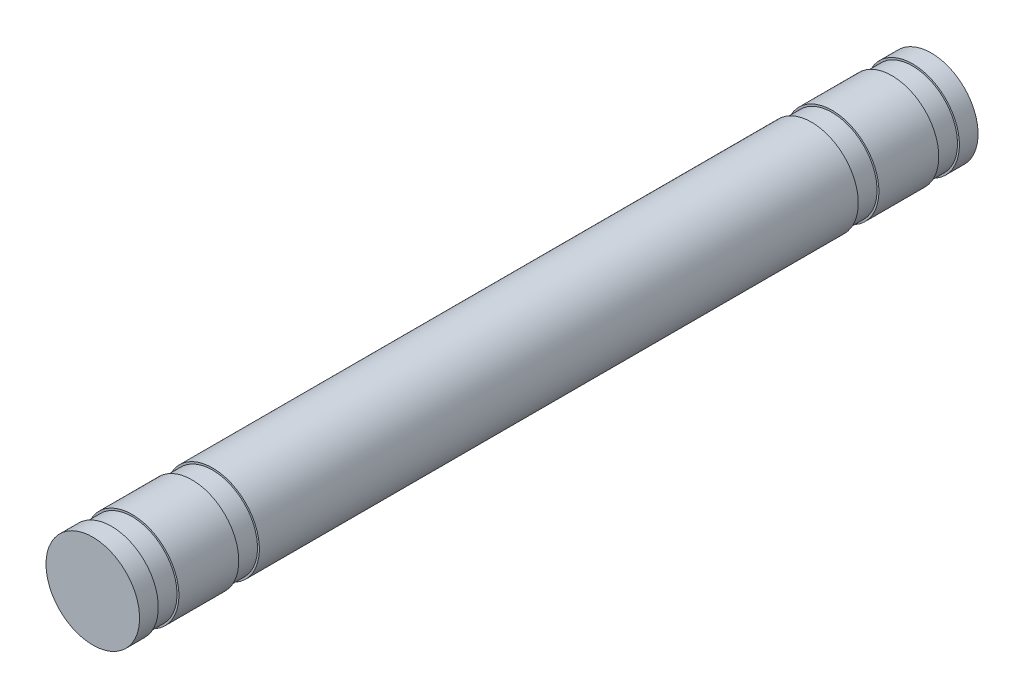
ISO-10303-21;
HEADER;
FILE_DESCRIPTION(('STEP AP214'),'2;1');
FILE_NAME('part.step','',(''),(''),'','','');
FILE_SCHEMA(('AUTOMOTIVE_DESIGN { 1 0 10303 214 1 1 1 1 }'));
ENDSEC;
DATA;
#1=APPLICATION_CONTEXT('core data for automotive mechanical design processes');
#2=APPLICATION_PROTOCOL_DEFINITION('international standard','automotive_design',2000,#1);
#3=PRODUCT_CONTEXT('',#1,'mechanical');
#4=PRODUCT('Part','Part','',(#3));
#5=PRODUCT_RELATED_PRODUCT_CATEGORY('part','',(#4));
#6=PRODUCT_DEFINITION_FORMATION('','',#4);
#7=PRODUCT_DEFINITION_CONTEXT('part definition',#1,'design');
#8=PRODUCT_DEFINITION('design','',#6,#7);
#9=PRODUCT_DEFINITION_SHAPE('','',#8);
#10=(LENGTH_UNIT() NAMED_UNIT(*) SI_UNIT(.MILLI.,.METRE.));
#11=(NAMED_UNIT(*) PLANE_ANGLE_UNIT() SI_UNIT($,.RADIAN.));
#12=(NAMED_UNIT(*) SI_UNIT($,.STERADIAN.) SOLID_ANGLE_UNIT());
#13=UNCERTAINTY_MEASURE_WITH_UNIT(LENGTH_MEASURE(1.E-05),#10,'distance_accuracy_value','');
#14=(GEOMETRIC_REPRESENTATION_CONTEXT(3) GLOBAL_UNCERTAINTY_ASSIGNED_CONTEXT((#13)) GLOBAL_UNIT_ASSIGNED_CONTEXT((#10,
#11,#12)) REPRESENTATION_CONTEXT('',''));
#15=CARTESIAN_POINT('',(0.,0.,0.));
#16=DIRECTION('',(0.,0.,1.));
#17=DIRECTION('',(1.,0.,0.));
#18=AXIS2_PLACEMENT_3D('',#15,#16,#17);
#19=CARTESIAN_POINT('',(0.,0.,0.));
#20=DIRECTION('',(0.,0.,1.));
#21=DIRECTION('',(1.,0.,0.));
#22=AXIS2_PLACEMENT_3D('',#19,#20,#21);
#23=PLANE('',#22);
#24=CARTESIAN_POINT('',(0.,0.,0.));
#25=DIRECTION('',(0.,0.,-1.));
#26=DIRECTION('',(-1.,0.,0.));
#27=AXIS2_PLACEMENT_3D('',#24,#25,#26);
#28=CIRCLE('',#27,2.5);
#29=CARTESIAN_POINT('',(-2.5,0.,0.));
#30=VERTEX_POINT('',#29);
#31=EDGE_CURVE('E12',#30,#30,#28,.T.);
#32=ORIENTED_EDGE('',*,*,#31,.F.);
#33=EDGE_LOOP('',(#32));
#34=FACE_BOUND('',#33,.T.);
#35=ADVANCED_FACE('F47',(#34),#23,.T.);
#36=CARTESIAN_POINT('',(0.,0.,-44.8));
#37=DIRECTION('',(0.,0.,-1.));
#38=DIRECTION('',(-1.,0.,0.));
#39=AXIS2_PLACEMENT_3D('',#36,#37,#38);
#40=CYLINDRICAL_SURFACE('',#39,2.5);
#41=ORIENTED_EDGE('',*,*,#31,.T.);
#42=EDGE_LOOP('',(#41));
#43=FACE_BOUND('',#42,.T.);
#44=CARTESIAN_POINT('',(0.,0.,-1.));
#45=DIRECTION('',(0.,0.,-1.));
#46=DIRECTION('',(-1.,0.,0.));
#47=AXIS2_PLACEMENT_3D('',#44,#45,#46);
#48=CIRCLE('',#47,2.5);
#49=CARTESIAN_POINT('',(-2.5,0.,-1.));
#50=VERTEX_POINT('',#49);
#51=EDGE_CURVE('E53',#50,#50,#48,.T.);
#52=ORIENTED_EDGE('',*,*,#51,.F.);
#53=EDGE_LOOP('',(#52));
#54=FACE_BOUND('',#53,.T.);
#55=ADVANCED_FACE('F125',(#43,#54),#40,.T.);
#56=CARTESIAN_POINT('',(-2.5,0.,-1.));
#57=DIRECTION('',(0.,0.,-1.));
#58=DIRECTION('',(-1.,0.,0.));
#59=AXIS2_PLACEMENT_3D('',#56,#57,#58);
#60=PLANE('',#59);
#61=ORIENTED_EDGE('',*,*,#51,.T.);
#62=EDGE_LOOP('',(#61));
#63=FACE_BOUND('',#62,.T.);
#64=CARTESIAN_POINT('',(0.,0.,-1.));
#65=DIRECTION('',(0.,0.,-1.));
#66=DIRECTION('',(-1.,0.,0.));
#67=AXIS2_PLACEMENT_3D('',#64,#65,#66);
#68=CIRCLE('',#67,2.4);
#69=CARTESIAN_POINT('',(-2.4,0.,-1.));
#70=VERTEX_POINT('',#69);
#71=EDGE_CURVE('E57',#70,#70,#68,.T.);
#72=ORIENTED_EDGE('',*,*,#71,.F.);
#73=EDGE_LOOP('',(#72));
#74=FACE_BOUND('',#73,.T.);
#75=ADVANCED_FACE('F130',(#63,#74),#60,.T.);
#76=CARTESIAN_POINT('',(0.,0.,-44.8));
#77=DIRECTION('',(0.,0.,-1.));
#78=DIRECTION('',(-1.,0.,0.));
#79=AXIS2_PLACEMENT_3D('',#76,#77,#78);
#80=CYLINDRICAL_SURFACE('',#79,2.4);
#81=ORIENTED_EDGE('',*,*,#71,.T.);
#82=EDGE_LOOP('',(#81));
#83=FACE_BOUND('',#82,.T.);
#84=CARTESIAN_POINT('',(0.,0.,-2.1));
#85=DIRECTION('',(0.,0.,-1.));
#86=DIRECTION('',(-1.,0.,0.));
#87=AXIS2_PLACEMENT_3D('',#84,#85,#86);
#88=CIRCLE('',#87,2.4);
#89=CARTESIAN_POINT('',(-2.4,0.,-2.1));
#90=VERTEX_POINT('',#89);
#91=EDGE_CURVE('E61',#90,#90,#88,.T.);
#92=ORIENTED_EDGE('',*,*,#91,.F.);
#93=EDGE_LOOP('',(#92));
#94=FACE_BOUND('',#93,.T.);
#95=ADVANCED_FACE('F134',(#83,#94),#80,.T.);
#96=CARTESIAN_POINT('',(-2.4,0.,-2.1));
#97=DIRECTION('',(0.,0.,1.));
#98=DIRECTION('',(1.,0.,0.));
#99=AXIS2_PLACEMENT_3D('',#96,#97,#98);
#100=PLANE('',#99);
#101=ORIENTED_EDGE('',*,*,#91,.T.);
#102=EDGE_LOOP('',(#101));
#103=FACE_BOUND('',#102,.T.);
#104=CARTESIAN_POINT('',(0.,0.,-2.1));
#105=DIRECTION('',(0.,0.,-1.));
#106=DIRECTION('',(-1.,0.,0.));
#107=AXIS2_PLACEMENT_3D('',#104,#105,#106);
#108=CIRCLE('',#107,2.5);
#109=CARTESIAN_POINT('',(-2.5,0.,-2.1));
#110=VERTEX_POINT('',#109);
#111=EDGE_CURVE('E66',#110,#110,#108,.T.);
#112=ORIENTED_EDGE('',*,*,#111,.F.);
#113=EDGE_LOOP('',(#112));
#114=FACE_BOUND('',#113,.T.);
#115=ADVANCED_FACE('F140',(#103,#114),#100,.T.);
#116=CARTESIAN_POINT('',(0.,0.,-44.8));
#117=DIRECTION('',(0.,0.,-1.));
#118=DIRECTION('',(-1.,0.,0.));
#119=AXIS2_PLACEMENT_3D('',#116,#117,#118);
#120=CYLINDRICAL_SURFACE('',#119,2.5);
#121=ORIENTED_EDGE('',*,*,#111,.T.);
#122=EDGE_LOOP('',(#121));
#123=FACE_BOUND('',#122,.T.);
#124=CARTESIAN_POINT('',(0.,0.,-5.3));
#125=DIRECTION('',(0.,0.,-1.));
#126=DIRECTION('',(-1.,0.,0.));
#127=AXIS2_PLACEMENT_3D('',#124,#125,#126);
#128=CIRCLE('',#127,2.5);
#129=CARTESIAN_POINT('',(-2.5,0.,-5.3));
#130=VERTEX_POINT('',#129);
#131=EDGE_CURVE('E69',#130,#130,#128,.T.);
#132=ORIENTED_EDGE('',*,*,#131,.F.);
#133=EDGE_LOOP('',(#132));
#134=FACE_BOUND('',#133,.T.);
#135=ADVANCED_FACE('F144',(#123,#134),#120,.T.);
#136=CARTESIAN_POINT('',(-2.5,0.,-5.3));
#137=DIRECTION('',(0.,0.,-1.));
#138=DIRECTION('',(-1.,0.,0.));
#139=AXIS2_PLACEMENT_3D('',#136,#137,#138);
#140=PLANE('',#139);
#141=ORIENTED_EDGE('',*,*,#131,.T.);
#142=EDGE_LOOP('',(#141));
#143=FACE_BOUND('',#142,.T.);
#144=CARTESIAN_POINT('',(0.,0.,-5.3));
#145=DIRECTION('',(0.,0.,-1.));
#146=DIRECTION('',(-1.,0.,0.));
#147=AXIS2_PLACEMENT_3D('',#144,#145,#146);
#148=CIRCLE('',#147,2.4);
#149=CARTESIAN_POINT('',(-2.4,0.,-5.3));
#150=VERTEX_POINT('',#149);
#151=EDGE_CURVE('E72',#150,#150,#148,.T.);
#152=ORIENTED_EDGE('',*,*,#151,.F.);
#153=EDGE_LOOP('',(#152));
#154=FACE_BOUND('',#153,.T.);
#155=ADVANCED_FACE('F148',(#143,#154),#140,.T.);
#156=CARTESIAN_POINT('',(0.,0.,-44.8));
#157=DIRECTION('',(0.,0.,-1.));
#158=DIRECTION('',(-1.,0.,0.));
#159=AXIS2_PLACEMENT_3D('',#156,#157,#158);
#160=CYLINDRICAL_SURFACE('',#159,2.4);
#161=ORIENTED_EDGE('',*,*,#151,.T.);
#162=EDGE_LOOP('',(#161));
#163=FACE_BOUND('',#162,.T.);
#164=CARTESIAN_POINT('',(0.,0.,-6.4));
#165=DIRECTION('',(0.,0.,-1.));
#166=DIRECTION('',(-1.,0.,0.));
#167=AXIS2_PLACEMENT_3D('',#164,#165,#166);
#168=CIRCLE('',#167,2.4);
#169=CARTESIAN_POINT('',(-2.4,0.,-6.4));
#170=VERTEX_POINT('',#169);
#171=EDGE_CURVE('E75',#170,#170,#168,.T.);
#172=ORIENTED_EDGE('',*,*,#171,.F.);
#173=EDGE_LOOP('',(#172));
#174=FACE_BOUND('',#173,.T.);
#175=ADVANCED_FACE('F152',(#163,#174),#160,.T.);
#176=CARTESIAN_POINT('',(-2.4,0.,-6.4));
#177=DIRECTION('',(0.,0.,1.));
#178=DIRECTION('',(1.,0.,0.));
#179=AXIS2_PLACEMENT_3D('',#176,#177,#178);
#180=PLANE('',#179);
#181=ORIENTED_EDGE('',*,*,#171,.T.);
#182=EDGE_LOOP('',(#181));
#183=FACE_BOUND('',#182,.T.);
#184=CARTESIAN_POINT('',(0.,0.,-6.4));
#185=DIRECTION('',(0.,0.,-1.));
#186=DIRECTION('',(-1.,0.,0.));
#187=AXIS2_PLACEMENT_3D('',#184,#185,#186);
#188=CIRCLE('',#187,2.5);
#189=CARTESIAN_POINT('',(-2.5,0.,-6.4));
#190=VERTEX_POINT('',#189);
#191=EDGE_CURVE('E78',#190,#190,#188,.T.);
#192=ORIENTED_EDGE('',*,*,#191,.F.);
#193=EDGE_LOOP('',(#192));
#194=FACE_BOUND('',#193,.T.);
#195=ADVANCED_FACE('F156',(#183,#194),#180,.T.);
#196=CARTESIAN_POINT('',(0.,0.,-44.8));
#197=DIRECTION('',(0.,0.,-1.));
#198=DIRECTION('',(-1.,0.,0.));
#199=AXIS2_PLACEMENT_3D('',#196,#197,#198);
#200=CYLINDRICAL_SURFACE('',#199,2.5);
#201=ORIENTED_EDGE('',*,*,#191,.T.);
#202=EDGE_LOOP('',(#201));
#203=FACE_BOUND('',#202,.T.);
#204=CARTESIAN_POINT('',(0.,0.,-38.4));
#205=DIRECTION('',(0.,0.,-1.));
#206=DIRECTION('',(-1.,0.,0.));
#207=AXIS2_PLACEMENT_3D('',#204,#205,#206);
#208=CIRCLE('',#207,2.5);
#209=CARTESIAN_POINT('',(-2.5,0.,-38.4));
#210=VERTEX_POINT('',#209);
#211=EDGE_CURVE('E81',#210,#210,#208,.T.);
#212=ORIENTED_EDGE('',*,*,#211,.F.);
#213=EDGE_LOOP('',(#212));
#214=FACE_BOUND('',#213,.T.);
#215=ADVANCED_FACE('F160',(#203,#214),#200,.T.);
#216=CARTESIAN_POINT('',(-2.5,0.,-38.4));
#217=DIRECTION('',(0.,0.,-1.));
#218=DIRECTION('',(-1.,0.,0.));
#219=AXIS2_PLACEMENT_3D('',#216,#217,#218);
#220=PLANE('',#219);
#221=ORIENTED_EDGE('',*,*,#211,.T.);
#222=EDGE_LOOP('',(#221));
#223=FACE_BOUND('',#222,.T.);
#224=CARTESIAN_POINT('',(0.,0.,-38.4));
#225=DIRECTION('',(0.,0.,-1.));
#226=DIRECTION('',(-1.,0.,0.));
#227=AXIS2_PLACEMENT_3D('',#224,#225,#226);
#228=CIRCLE('',#227,2.4);
#229=CARTESIAN_POINT('',(-2.4,0.,-38.4));
#230=VERTEX_POINT('',#229);
#231=EDGE_CURVE('E84',#230,#230,#228,.T.);
#232=ORIENTED_EDGE('',*,*,#231,.F.);
#233=EDGE_LOOP('',(#232));
#234=FACE_BOUND('',#233,.T.);
#235=ADVANCED_FACE('F164',(#223,#234),#220,.T.);
#236=CARTESIAN_POINT('',(0.,0.,-44.8));
#237=DIRECTION('',(0.,0.,-1.));
#238=DIRECTION('',(-1.,0.,0.));
#239=AXIS2_PLACEMENT_3D('',#236,#237,#238);
#240=CYLINDRICAL_SURFACE('',#239,2.4);
#241=ORIENTED_EDGE('',*,*,#231,.T.);
#242=EDGE_LOOP('',(#241));
#243=FACE_BOUND('',#242,.T.);
#244=CARTESIAN_POINT('',(0.,0.,-39.5));
#245=DIRECTION('',(0.,0.,-1.));
#246=DIRECTION('',(-1.,0.,0.));
#247=AXIS2_PLACEMENT_3D('',#244,#245,#246);
#248=CIRCLE('',#247,2.4);
#249=CARTESIAN_POINT('',(-2.4,0.,-39.5));
#250=VERTEX_POINT('',#249);
#251=EDGE_CURVE('E87',#250,#250,#248,.T.);
#252=ORIENTED_EDGE('',*,*,#251,.F.);
#253=EDGE_LOOP('',(#252));
#254=FACE_BOUND('',#253,.T.);
#255=ADVANCED_FACE('F168',(#243,#254),#240,.T.);
#256=CARTESIAN_POINT('',(-2.4,0.,-39.5));
#257=DIRECTION('',(0.,0.,1.));
#258=DIRECTION('',(1.,0.,0.));
#259=AXIS2_PLACEMENT_3D('',#256,#257,#258);
#260=PLANE('',#259);
#261=ORIENTED_EDGE('',*,*,#251,.T.);
#262=EDGE_LOOP('',(#261));
#263=FACE_BOUND('',#262,.T.);
#264=CARTESIAN_POINT('',(0.,0.,-39.5));
#265=DIRECTION('',(0.,0.,-1.));
#266=DIRECTION('',(-1.,0.,0.));
#267=AXIS2_PLACEMENT_3D('',#264,#265,#266);
#268=CIRCLE('',#267,2.5);
#269=CARTESIAN_POINT('',(-2.5,0.,-39.5));
#270=VERTEX_POINT('',#269);
#271=EDGE_CURVE('E90',#270,#270,#268,.T.);
#272=ORIENTED_EDGE('',*,*,#271,.F.);
#273=EDGE_LOOP('',(#272));
#274=FACE_BOUND('',#273,.T.);
#275=ADVANCED_FACE('F172',(#263,#274),#260,.T.);
#276=CARTESIAN_POINT('',(0.,0.,-44.8));
#277=DIRECTION('',(0.,0.,-1.));
#278=DIRECTION('',(-1.,0.,0.));
#279=AXIS2_PLACEMENT_3D('',#276,#277,#278);
#280=CYLINDRICAL_SURFACE('',#279,2.5);
#281=ORIENTED_EDGE('',*,*,#271,.T.);
#282=EDGE_LOOP('',(#281));
#283=FACE_BOUND('',#282,.T.);
#284=CARTESIAN_POINT('',(0.,0.,-42.7));
#285=DIRECTION('',(0.,0.,-1.));
#286=DIRECTION('',(-1.,0.,0.));
#287=AXIS2_PLACEMENT_3D('',#284,#285,#286);
#288=CIRCLE('',#287,2.5);
#289=CARTESIAN_POINT('',(-2.5,0.,-42.7));
#290=VERTEX_POINT('',#289);
#291=EDGE_CURVE('E93',#290,#290,#288,.T.);
#292=ORIENTED_EDGE('',*,*,#291,.F.);
#293=EDGE_LOOP('',(#292));
#294=FACE_BOUND('',#293,.T.);
#295=ADVANCED_FACE('F176',(#283,#294),#280,.T.);
#296=CARTESIAN_POINT('',(-2.5,0.,-42.7));
#297=DIRECTION('',(0.,0.,-1.));
#298=DIRECTION('',(-1.,0.,0.));
#299=AXIS2_PLACEMENT_3D('',#296,#297,#298);
#300=PLANE('',#299);
#301=ORIENTED_EDGE('',*,*,#291,.T.);
#302=EDGE_LOOP('',(#301));
#303=FACE_BOUND('',#302,.T.);
#304=CARTESIAN_POINT('',(0.,0.,-42.7));
#305=DIRECTION('',(0.,0.,-1.));
#306=DIRECTION('',(-1.,0.,0.));
#307=AXIS2_PLACEMENT_3D('',#304,#305,#306);
#308=CIRCLE('',#307,2.4);
#309=CARTESIAN_POINT('',(-2.4,0.,-42.7));
#310=VERTEX_POINT('',#309);
#311=EDGE_CURVE('E96',#310,#310,#308,.T.);
#312=ORIENTED_EDGE('',*,*,#311,.F.);
#313=EDGE_LOOP('',(#312));
#314=FACE_BOUND('',#313,.T.);
#315=ADVANCED_FACE('F180',(#303,#314),#300,.T.);
#316=CARTESIAN_POINT('',(0.,0.,-44.8));
#317=DIRECTION('',(0.,0.,-1.));
#318=DIRECTION('',(-1.,0.,0.));
#319=AXIS2_PLACEMENT_3D('',#316,#317,#318);
#320=CYLINDRICAL_SURFACE('',#319,2.4);
#321=ORIENTED_EDGE('',*,*,#311,.T.);
#322=EDGE_LOOP('',(#321));
#323=FACE_BOUND('',#322,.T.);
#324=CARTESIAN_POINT('',(0.,0.,-43.8));
#325=DIRECTION('',(0.,0.,-1.));
#326=DIRECTION('',(-1.,0.,0.));
#327=AXIS2_PLACEMENT_3D('',#324,#325,#326);
#328=CIRCLE('',#327,2.4);
#329=CARTESIAN_POINT('',(-2.4,0.,-43.8));
#330=VERTEX_POINT('',#329);
#331=EDGE_CURVE('E99',#330,#330,#328,.T.);
#332=ORIENTED_EDGE('',*,*,#331,.F.);
#333=EDGE_LOOP('',(#332));
#334=FACE_BOUND('',#333,.T.);
#335=ADVANCED_FACE('F121',(#323,#334),#320,.T.);
#336=CARTESIAN_POINT('',(-2.4,0.,-43.8));
#337=DIRECTION('',(0.,0.,1.));
#338=DIRECTION('',(1.,0.,0.));
#339=AXIS2_PLACEMENT_3D('',#336,#337,#338);
#340=PLANE('',#339);
#341=ORIENTED_EDGE('',*,*,#331,.T.);
#342=EDGE_LOOP('',(#341));
#343=FACE_BOUND('',#342,.T.);
#344=CARTESIAN_POINT('',(0.,0.,-43.8));
#345=DIRECTION('',(0.,0.,-1.));
#346=DIRECTION('',(-1.,0.,0.));
#347=AXIS2_PLACEMENT_3D('',#344,#345,#346);
#348=CIRCLE('',#347,2.5);
#349=CARTESIAN_POINT('',(-2.5,0.,-43.8));
#350=VERTEX_POINT('',#349);
#351=EDGE_CURVE('E102',#350,#350,#348,.T.);
#352=ORIENTED_EDGE('',*,*,#351,.F.);
#353=EDGE_LOOP('',(#352));
#354=FACE_BOUND('',#353,.T.);
#355=ADVANCED_FACE('F113',(#343,#354),#340,.T.);
#356=CARTESIAN_POINT('',(0.,0.,-44.8));
#357=DIRECTION('',(0.,0.,-1.));
#358=DIRECTION('',(-1.,0.,0.));
#359=AXIS2_PLACEMENT_3D('',#356,#357,#358);
#360=CYLINDRICAL_SURFACE('',#359,2.5);
#361=ORIENTED_EDGE('',*,*,#351,.T.);
#362=EDGE_LOOP('',(#361));
#363=FACE_BOUND('',#362,.T.);
#364=CARTESIAN_POINT('',(0.,0.,-44.8));
#365=DIRECTION('',(0.,0.,-1.));
#366=DIRECTION('',(-1.,0.,0.));
#367=AXIS2_PLACEMENT_3D('',#364,#365,#366);
#368=CIRCLE('',#367,2.5);
#369=CARTESIAN_POINT('',(-2.5,0.,-44.8));
#370=VERTEX_POINT('',#369);
#371=EDGE_CURVE('E105',#370,#370,#368,.T.);
#372=ORIENTED_EDGE('',*,*,#371,.F.);
#373=EDGE_LOOP('',(#372));
#374=FACE_BOUND('',#373,.T.);
#375=ADVANCED_FACE('F111',(#363,#374),#360,.T.);
#376=CARTESIAN_POINT('',(-2.5,0.,-44.8));
#377=DIRECTION('',(0.,0.,-1.));
#378=DIRECTION('',(-1.,0.,0.));
#379=AXIS2_PLACEMENT_3D('',#376,#377,#378);
#380=PLANE('',#379);
#381=ORIENTED_EDGE('',*,*,#371,.T.);
#382=EDGE_LOOP('',(#381));
#383=FACE_BOUND('',#382,.T.);
#384=ADVANCED_FACE('F109',(#383),#380,.T.);
#385=CLOSED_SHELL('',(#35,#55,#75,#95,#115,#135,#155,#175,#195,#215,#235,#255,#275,#295,#315,
#335,#355,#375,#384));
#386=MANIFOLD_SOLID_BREP('B2',#385);
#387=ADVANCED_BREP_SHAPE_REPRESENTATION('',(#18,#386),#14);
#388=SHAPE_DEFINITION_REPRESENTATION(#9,#387);
ENDSEC;
END-ISO-10303-21;
